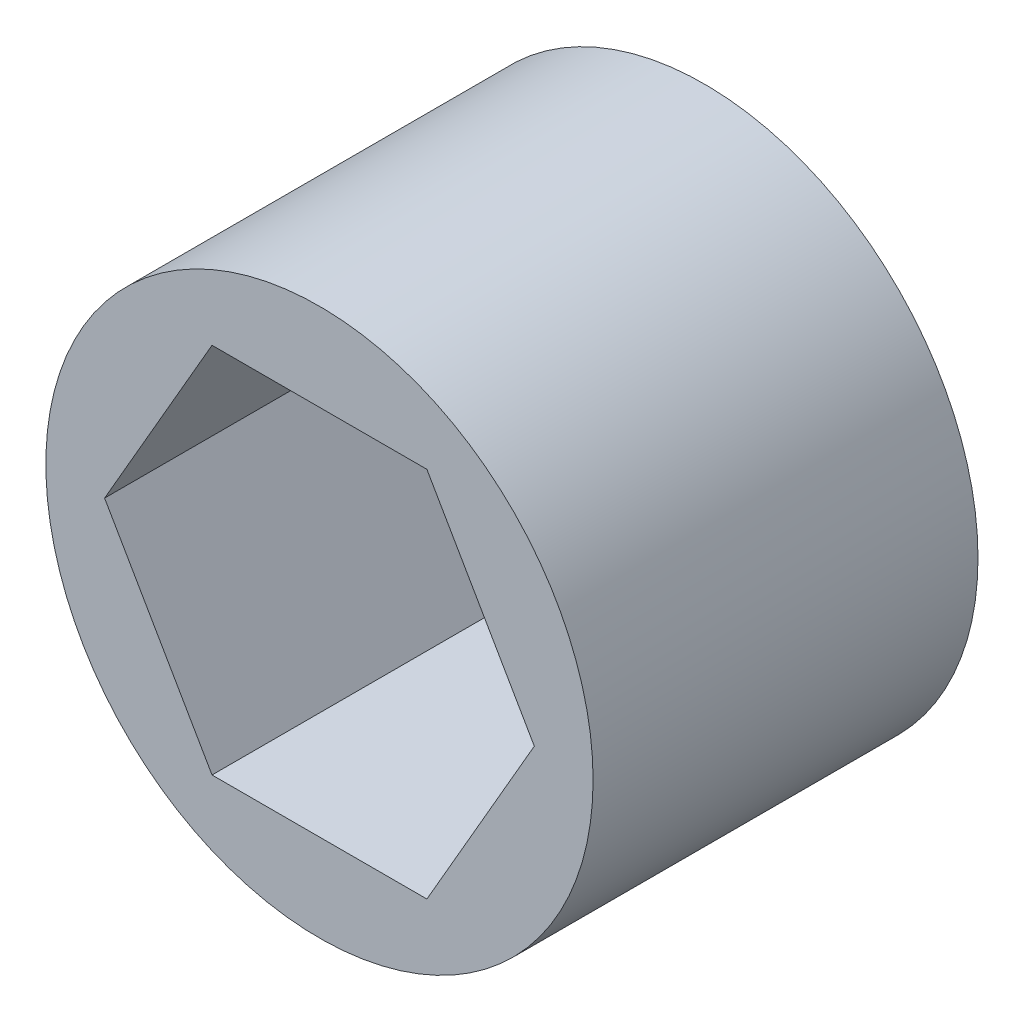
ISO-10303-21;
HEADER;
FILE_DESCRIPTION(('STEP AP214'),'2;1');
FILE_NAME('part.step','',(''),(''),'','','');
FILE_SCHEMA(('AUTOMOTIVE_DESIGN { 1 0 10303 214 1 1 1 1 }'));
ENDSEC;
DATA;
#1=APPLICATION_CONTEXT('core data for automotive mechanical design processes');
#2=APPLICATION_PROTOCOL_DEFINITION('international standard','automotive_design',2000,#1);
#3=PRODUCT_CONTEXT('',#1,'mechanical');
#4=PRODUCT('Part','Part','',(#3));
#5=PRODUCT_RELATED_PRODUCT_CATEGORY('part','',(#4));
#6=PRODUCT_DEFINITION_FORMATION('','',#4);
#7=PRODUCT_DEFINITION_CONTEXT('part definition',#1,'design');
#8=PRODUCT_DEFINITION('design','',#6,#7);
#9=PRODUCT_DEFINITION_SHAPE('','',#8);
#10=(LENGTH_UNIT() NAMED_UNIT(*) SI_UNIT(.MILLI.,.METRE.));
#11=(NAMED_UNIT(*) PLANE_ANGLE_UNIT() SI_UNIT($,.RADIAN.));
#12=(NAMED_UNIT(*) SI_UNIT($,.STERADIAN.) SOLID_ANGLE_UNIT());
#13=UNCERTAINTY_MEASURE_WITH_UNIT(LENGTH_MEASURE(1.E-05),#10,'distance_accuracy_value','');
#14=(GEOMETRIC_REPRESENTATION_CONTEXT(3) GLOBAL_UNCERTAINTY_ASSIGNED_CONTEXT((#13)) GLOBAL_UNIT_ASSIGNED_CONTEXT((#10,
#11,#12)) REPRESENTATION_CONTEXT('',''));
#15=CARTESIAN_POINT('',(0.,0.,0.));
#16=DIRECTION('',(0.,0.,1.));
#17=DIRECTION('',(1.,0.,0.));
#18=AXIS2_PLACEMENT_3D('',#15,#16,#17);
#19=CARTESIAN_POINT('',(0.,0.,6.69925));
#20=DIRECTION('',(0.,0.,1.));
#21=DIRECTION('',(1.,0.,0.));
#22=AXIS2_PLACEMENT_3D('',#19,#20,#21);
#23=PLANE('',#22);
#24=CARTESIAN_POINT('',(0.,0.,6.69925));
#25=DIRECTION('',(0.,0.,1.));
#26=DIRECTION('',(1.,0.,0.));
#27=AXIS2_PLACEMENT_3D('',#24,#25,#26);
#28=CIRCLE('',#27,9.525);
#29=CARTESIAN_POINT('',(9.525,0.,6.69925));
#30=VERTEX_POINT('',#29);
#31=EDGE_CURVE('E11',#30,#30,#28,.T.);
#32=ORIENTED_EDGE('',*,*,#31,.T.);
#33=EDGE_LOOP('',(#32));
#34=FACE_BOUND('',#33,.T.);
#35=DIRECTION('',(-0.5,0.866025403784438,0.));
#36=VECTOR('',#35,1.);
#37=CARTESIAN_POINT('',(7.47899538708241,0.,6.69925));
#38=LINE('',#37,#36);
#39=CARTESIAN_POINT('',(7.47899538708241,0.,6.69925));
#40=VERTEX_POINT('',#39);
#41=CARTESIAN_POINT('',(3.7394976935412,6.477,6.69925));
#42=VERTEX_POINT('',#41);
#43=EDGE_CURVE('E108',#40,#42,#38,.T.);
#44=ORIENTED_EDGE('',*,*,#43,.F.);
#45=DIRECTION('',(0.5,0.866025403784439,0.));
#46=VECTOR('',#45,1.);
#47=CARTESIAN_POINT('',(3.73949769354121,-6.477,6.69925));
#48=LINE('',#47,#46);
#49=CARTESIAN_POINT('',(3.73949769354121,-6.477,6.69925));
#50=VERTEX_POINT('',#49);
#51=EDGE_CURVE('E99',#50,#40,#48,.T.);
#52=ORIENTED_EDGE('',*,*,#51,.F.);
#53=DIRECTION('',(1.,0.,0.));
#54=VECTOR('',#53,1.);
#55=CARTESIAN_POINT('',(-3.73949769354121,-6.477,6.69925));
#56=LINE('',#55,#54);
#57=CARTESIAN_POINT('',(-3.73949769354121,-6.477,6.69925));
#58=VERTEX_POINT('',#57);
#59=EDGE_CURVE('E133',#58,#50,#56,.T.);
#60=ORIENTED_EDGE('',*,*,#59,.F.);
#61=DIRECTION('',(0.5,-0.866025403784438,0.));
#62=VECTOR('',#61,1.);
#63=CARTESIAN_POINT('',(-7.47899538708241,0.,6.69925));
#64=LINE('',#63,#62);
#65=CARTESIAN_POINT('',(-7.47899538708241,0.,6.69925));
#66=VERTEX_POINT('',#65);
#67=EDGE_CURVE('E130',#66,#58,#64,.T.);
#68=ORIENTED_EDGE('',*,*,#67,.F.);
#69=DIRECTION('',(-0.5,-0.866025403784439,0.));
#70=VECTOR('',#69,1.);
#71=CARTESIAN_POINT('',(-3.73949769354121,6.477,6.69925));
#72=LINE('',#71,#70);
#73=CARTESIAN_POINT('',(-3.73949769354121,6.477,6.69925));
#74=VERTEX_POINT('',#73);
#75=EDGE_CURVE('E125',#74,#66,#72,.T.);
#76=ORIENTED_EDGE('',*,*,#75,.F.);
#77=DIRECTION('',(-1.,0.,0.));
#78=VECTOR('',#77,1.);
#79=CARTESIAN_POINT('',(3.7394976935412,6.477,6.69925));
#80=LINE('',#79,#78);
#81=EDGE_CURVE('E121',#42,#74,#80,.T.);
#82=ORIENTED_EDGE('',*,*,#81,.F.);
#83=EDGE_LOOP('',(#44,#52,#60,#68,#76,#82));
#84=FACE_BOUND('',#83,.T.);
#85=ADVANCED_FACE('F45',(#34,#84),#23,.T.);
#86=CARTESIAN_POINT('',(0.,0.,-6.69925));
#87=DIRECTION('',(0.,0.,1.));
#88=DIRECTION('',(1.,0.,0.));
#89=AXIS2_PLACEMENT_3D('',#86,#87,#88);
#90=PLANE('',#89);
#91=CARTESIAN_POINT('',(0.,0.,-6.69925));
#92=DIRECTION('',(0.,0.,1.));
#93=DIRECTION('',(1.,0.,0.));
#94=AXIS2_PLACEMENT_3D('',#91,#92,#93);
#95=CIRCLE('',#94,9.525);
#96=CARTESIAN_POINT('',(9.525,0.,-6.69925));
#97=VERTEX_POINT('',#96);
#98=EDGE_CURVE('E49',#97,#97,#95,.T.);
#99=ORIENTED_EDGE('',*,*,#98,.F.);
#100=EDGE_LOOP('',(#99));
#101=FACE_BOUND('',#100,.T.);
#102=DIRECTION('',(0.5,0.866025403784439,0.));
#103=VECTOR('',#102,1.);
#104=CARTESIAN_POINT('',(3.73949769354121,-6.477,-6.69925));
#105=LINE('',#104,#103);
#106=CARTESIAN_POINT('',(3.73949769354121,-6.477,-6.69925));
#107=VERTEX_POINT('',#106);
#108=CARTESIAN_POINT('',(7.47899538708241,0.,-6.69925));
#109=VERTEX_POINT('',#108);
#110=EDGE_CURVE('E69',#107,#109,#105,.T.);
#111=ORIENTED_EDGE('',*,*,#110,.T.);
#112=DIRECTION('',(-0.5,0.866025403784438,0.));
#113=VECTOR('',#112,1.);
#114=CARTESIAN_POINT('',(7.47899538708241,0.,-6.69925));
#115=LINE('',#114,#113);
#116=CARTESIAN_POINT('',(3.7394976935412,6.477,-6.69925));
#117=VERTEX_POINT('',#116);
#118=EDGE_CURVE('E115',#109,#117,#115,.T.);
#119=ORIENTED_EDGE('',*,*,#118,.T.);
#120=DIRECTION('',(-1.,0.,0.));
#121=VECTOR('',#120,1.);
#122=CARTESIAN_POINT('',(3.7394976935412,6.477,-6.69925));
#123=LINE('',#122,#121);
#124=CARTESIAN_POINT('',(-3.73949769354121,6.477,-6.69925));
#125=VERTEX_POINT('',#124);
#126=EDGE_CURVE('E140',#117,#125,#123,.T.);
#127=ORIENTED_EDGE('',*,*,#126,.T.);
#128=DIRECTION('',(-0.5,-0.866025403784439,0.));
#129=VECTOR('',#128,1.);
#130=CARTESIAN_POINT('',(-3.73949769354121,6.477,-6.69925));
#131=LINE('',#130,#129);
#132=CARTESIAN_POINT('',(-7.47899538708241,0.,-6.69925));
#133=VERTEX_POINT('',#132);
#134=EDGE_CURVE('E144',#125,#133,#131,.T.);
#135=ORIENTED_EDGE('',*,*,#134,.T.);
#136=DIRECTION('',(0.5,-0.866025403784438,0.));
#137=VECTOR('',#136,1.);
#138=CARTESIAN_POINT('',(-7.47899538708241,0.,-6.69925));
#139=LINE('',#138,#137);
#140=CARTESIAN_POINT('',(-3.73949769354121,-6.477,-6.69925));
#141=VERTEX_POINT('',#140);
#142=EDGE_CURVE('E148',#133,#141,#139,.T.);
#143=ORIENTED_EDGE('',*,*,#142,.T.);
#144=DIRECTION('',(1.,0.,0.));
#145=VECTOR('',#144,1.);
#146=CARTESIAN_POINT('',(-3.73949769354121,-6.477,-6.69925));
#147=LINE('',#146,#145);
#148=EDGE_CURVE('E109',#141,#107,#147,.T.);
#149=ORIENTED_EDGE('',*,*,#148,.T.);
#150=EDGE_LOOP('',(#111,#119,#127,#135,#143,#149));
#151=FACE_BOUND('',#150,.T.);
#152=ADVANCED_FACE('F172',(#101,#151),#90,.F.);
#153=CARTESIAN_POINT('',(0.,0.,6.69925));
#154=DIRECTION('',(0.,0.,-1.));
#155=DIRECTION('',(-1.,0.,0.));
#156=AXIS2_PLACEMENT_3D('',#153,#154,#155);
#157=CYLINDRICAL_SURFACE('',#156,9.525);
#158=ORIENTED_EDGE('',*,*,#31,.F.);
#159=EDGE_LOOP('',(#158));
#160=FACE_BOUND('',#159,.T.);
#161=ORIENTED_EDGE('',*,*,#98,.T.);
#162=EDGE_LOOP('',(#161));
#163=FACE_BOUND('',#162,.T.);
#164=ADVANCED_FACE('F47',(#160,#163),#157,.T.);
#165=CARTESIAN_POINT('',(3.73949769354121,-6.477,6.69925));
#166=DIRECTION('',(-0.866025403784439,0.5,0.));
#167=DIRECTION('',(-0.5,-0.866025403784439,0.));
#168=AXIS2_PLACEMENT_3D('',#165,#166,#167);
#169=PLANE('',#168);
#170=ORIENTED_EDGE('',*,*,#110,.F.);
#171=DIRECTION('',(0.,0.,-1.));
#172=VECTOR('',#171,1.);
#173=CARTESIAN_POINT('',(3.73949769354121,-6.477,6.69925));
#174=LINE('',#173,#172);
#175=EDGE_CURVE('E103',#50,#107,#174,.T.);
#176=ORIENTED_EDGE('',*,*,#175,.F.);
#177=ORIENTED_EDGE('',*,*,#51,.T.);
#178=DIRECTION('',(0.,0.,-1.));
#179=VECTOR('',#178,1.);
#180=CARTESIAN_POINT('',(7.47899538708241,0.,6.69925));
#181=LINE('',#180,#179);
#182=EDGE_CURVE('E102',#40,#109,#181,.T.);
#183=ORIENTED_EDGE('',*,*,#182,.T.);
#184=EDGE_LOOP('',(#170,#176,#177,#183));
#185=FACE_BOUND('',#184,.T.);
#186=ADVANCED_FACE('F101',(#185),#169,.T.);
#187=CARTESIAN_POINT('',(7.47899538708241,0.,6.69925));
#188=DIRECTION('',(-0.866025403784438,-0.5,0.));
#189=DIRECTION('',(0.5,-0.866025403784438,0.));
#190=AXIS2_PLACEMENT_3D('',#187,#188,#189);
#191=PLANE('',#190);
#192=ORIENTED_EDGE('',*,*,#118,.F.);
#193=ORIENTED_EDGE('',*,*,#182,.F.);
#194=ORIENTED_EDGE('',*,*,#43,.T.);
#195=DIRECTION('',(0.,0.,-1.));
#196=VECTOR('',#195,1.);
#197=CARTESIAN_POINT('',(3.7394976935412,6.477,6.69925));
#198=LINE('',#197,#196);
#199=EDGE_CURVE('E117',#42,#117,#198,.T.);
#200=ORIENTED_EDGE('',*,*,#199,.T.);
#201=EDGE_LOOP('',(#192,#193,#194,#200));
#202=FACE_BOUND('',#201,.T.);
#203=ADVANCED_FACE('F112',(#202),#191,.T.);
#204=CARTESIAN_POINT('',(3.7394976935412,6.477,6.69925));
#205=DIRECTION('',(0.,-1.,0.));
#206=DIRECTION('',(0.,0.,-1.));
#207=AXIS2_PLACEMENT_3D('',#204,#205,#206);
#208=PLANE('',#207);
#209=ORIENTED_EDGE('',*,*,#126,.F.);
#210=ORIENTED_EDGE('',*,*,#199,.F.);
#211=ORIENTED_EDGE('',*,*,#81,.T.);
#212=DIRECTION('',(0.,0.,-1.));
#213=VECTOR('',#212,1.);
#214=CARTESIAN_POINT('',(-3.73949769354121,6.477,6.69925));
#215=LINE('',#214,#213);
#216=EDGE_CURVE('E162',#74,#125,#215,.T.);
#217=ORIENTED_EDGE('',*,*,#216,.T.);
#218=EDGE_LOOP('',(#209,#210,#211,#217));
#219=FACE_BOUND('',#218,.T.);
#220=ADVANCED_FACE('F168',(#219),#208,.T.);
#221=CARTESIAN_POINT('',(-3.73949769354121,6.477,6.69925));
#222=DIRECTION('',(0.866025403784439,-0.5,0.));
#223=DIRECTION('',(0.5,0.866025403784439,0.));
#224=AXIS2_PLACEMENT_3D('',#221,#222,#223);
#225=PLANE('',#224);
#226=ORIENTED_EDGE('',*,*,#134,.F.);
#227=ORIENTED_EDGE('',*,*,#216,.F.);
#228=ORIENTED_EDGE('',*,*,#75,.T.);
#229=DIRECTION('',(0.,0.,-1.));
#230=VECTOR('',#229,1.);
#231=CARTESIAN_POINT('',(-7.47899538708241,0.,6.69925));
#232=LINE('',#231,#230);
#233=EDGE_CURVE('E159',#66,#133,#232,.T.);
#234=ORIENTED_EDGE('',*,*,#233,.T.);
#235=EDGE_LOOP('',(#226,#227,#228,#234));
#236=FACE_BOUND('',#235,.T.);
#237=ADVANCED_FACE('F180',(#236),#225,.T.);
#238=CARTESIAN_POINT('',(-7.47899538708241,0.,6.69925));
#239=DIRECTION('',(0.866025403784439,0.5,0.));
#240=DIRECTION('',(-0.5,0.866025403784439,0.));
#241=AXIS2_PLACEMENT_3D('',#238,#239,#240);
#242=PLANE('',#241);
#243=ORIENTED_EDGE('',*,*,#142,.F.);
#244=ORIENTED_EDGE('',*,*,#233,.F.);
#245=ORIENTED_EDGE('',*,*,#67,.T.);
#246=DIRECTION('',(0.,0.,-1.));
#247=VECTOR('',#246,1.);
#248=CARTESIAN_POINT('',(-3.73949769354121,-6.477,6.69925));
#249=LINE('',#248,#247);
#250=EDGE_CURVE('E61',#58,#141,#249,.T.);
#251=ORIENTED_EDGE('',*,*,#250,.T.);
#252=EDGE_LOOP('',(#243,#244,#245,#251));
#253=FACE_BOUND('',#252,.T.);
#254=ADVANCED_FACE('F178',(#253),#242,.T.);
#255=CARTESIAN_POINT('',(-3.73949769354121,-6.477,6.69925));
#256=DIRECTION('',(0.,1.,0.));
#257=DIRECTION('',(-1.,0.,0.));
#258=AXIS2_PLACEMENT_3D('',#255,#256,#257);
#259=PLANE('',#258);
#260=ORIENTED_EDGE('',*,*,#148,.F.);
#261=ORIENTED_EDGE('',*,*,#250,.F.);
#262=ORIENTED_EDGE('',*,*,#59,.T.);
#263=ORIENTED_EDGE('',*,*,#175,.T.);
#264=EDGE_LOOP('',(#260,#261,#262,#263));
#265=FACE_BOUND('',#264,.T.);
#266=ADVANCED_FACE('F174',(#265),#259,.T.);
#267=CLOSED_SHELL('',(#85,#152,#164,#186,#203,#220,#237,#254,#266));
#268=MANIFOLD_SOLID_BREP('B2',#267);
#269=ADVANCED_BREP_SHAPE_REPRESENTATION('',(#18,#268),#14);
#270=SHAPE_DEFINITION_REPRESENTATION(#9,#269);
ENDSEC;
END-ISO-10303-21;
